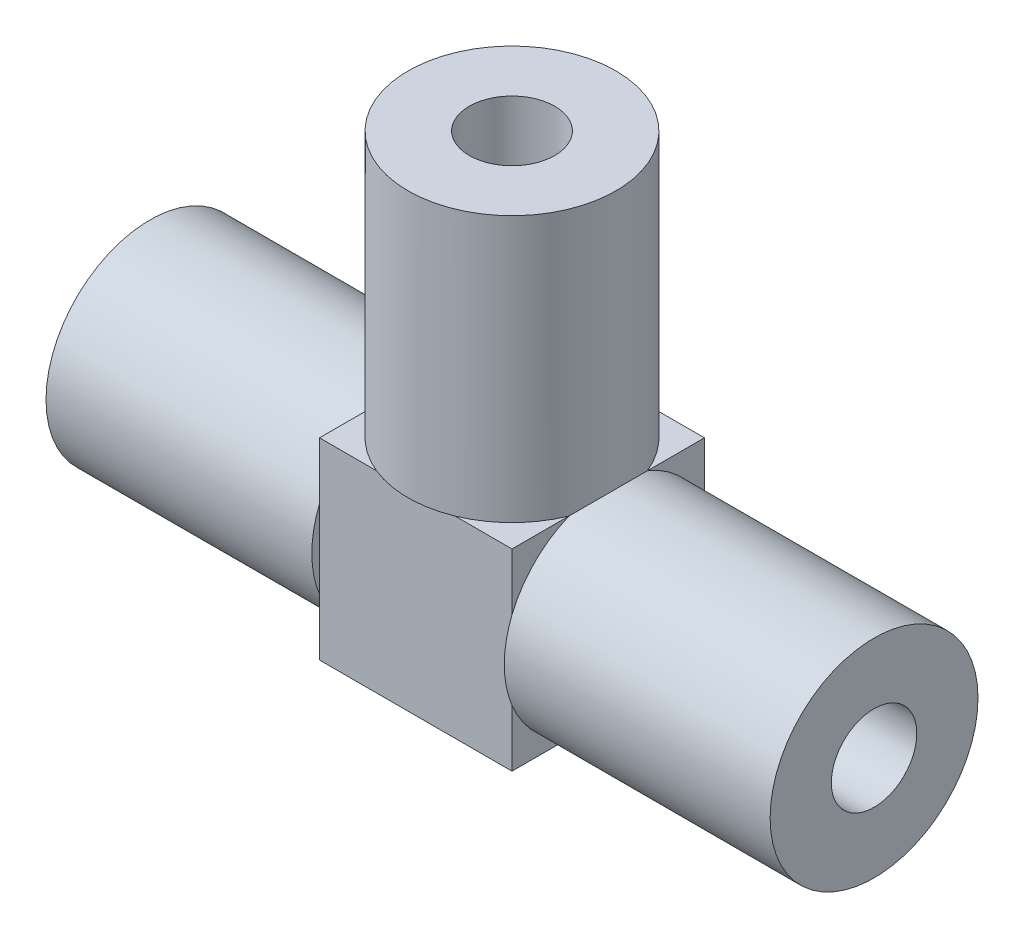
ISO-10303-21;
HEADER;
FILE_DESCRIPTION(('STEP AP214'),'2;1');
FILE_NAME('part.step','',(''),(''),'','','');
FILE_SCHEMA(('AUTOMOTIVE_DESIGN { 1 0 10303 214 1 1 1 1 }'));
ENDSEC;
DATA;
#1=APPLICATION_CONTEXT('core data for automotive mechanical design processes');
#2=APPLICATION_PROTOCOL_DEFINITION('international standard','automotive_design',2000,#1);
#3=PRODUCT_CONTEXT('',#1,'mechanical');
#4=PRODUCT('Part','Part','',(#3));
#5=PRODUCT_RELATED_PRODUCT_CATEGORY('part','',(#4));
#6=PRODUCT_DEFINITION_FORMATION('','',#4);
#7=PRODUCT_DEFINITION_CONTEXT('part definition',#1,'design');
#8=PRODUCT_DEFINITION('design','',#6,#7);
#9=PRODUCT_DEFINITION_SHAPE('','',#8);
#10=(LENGTH_UNIT() NAMED_UNIT(*) SI_UNIT(.MILLI.,.METRE.));
#11=(NAMED_UNIT(*) PLANE_ANGLE_UNIT() SI_UNIT($,.RADIAN.));
#12=(NAMED_UNIT(*) SI_UNIT($,.STERADIAN.) SOLID_ANGLE_UNIT());
#13=UNCERTAINTY_MEASURE_WITH_UNIT(LENGTH_MEASURE(1.E-05),#10,'distance_accuracy_value','');
#14=(GEOMETRIC_REPRESENTATION_CONTEXT(3) GLOBAL_UNCERTAINTY_ASSIGNED_CONTEXT((#13)) GLOBAL_UNIT_ASSIGNED_CONTEXT((#10,
#11,#12)) REPRESENTATION_CONTEXT('',''));
#15=CARTESIAN_POINT('',(0.,0.,0.));
#16=DIRECTION('',(0.,0.,1.));
#17=DIRECTION('',(1.,0.,0.));
#18=AXIS2_PLACEMENT_3D('',#15,#16,#17);
#19=CARTESIAN_POINT('',(-7.15,7.15,7.15));
#20=DIRECTION('',(1.,0.,0.));
#21=DIRECTION('',(0.,0.,-1.));
#22=AXIS2_PLACEMENT_3D('',#19,#20,#21);
#23=PLANE('',#22);
#24=CARTESIAN_POINT('',(-7.14999999999999,0.,0.));
#25=DIRECTION('',(-1.,0.,0.));
#26=DIRECTION('',(0.,0.,1.));
#27=AXIS2_PLACEMENT_3D('',#24,#25,#26);
#28=CIRCLE('',#27,7.722);
#29=CARTESIAN_POINT('',(-7.14999999999999,-2.91663916177508,-7.15));
#30=VERTEX_POINT('',#29);
#31=CARTESIAN_POINT('',(-7.14999999999999,-7.15,-2.91663916177508));
#32=VERTEX_POINT('',#31);
#33=EDGE_CURVE('E304',#30,#32,#28,.T.);
#34=ORIENTED_EDGE('',*,*,#33,.F.);
#35=DIRECTION('',(0.,-1.,0.));
#36=VECTOR('',#35,1.);
#37=CARTESIAN_POINT('',(-7.15,7.15,-7.15));
#38=LINE('',#37,#36);
#39=CARTESIAN_POINT('',(-7.15,-7.15,-7.15));
#40=VERTEX_POINT('',#39);
#41=EDGE_CURVE('E197',#30,#40,#38,.T.);
#42=ORIENTED_EDGE('',*,*,#41,.T.);
#43=DIRECTION('',(0.,0.,-1.));
#44=VECTOR('',#43,1.);
#45=CARTESIAN_POINT('',(-7.15,-7.15,7.15));
#46=LINE('',#45,#44);
#47=EDGE_CURVE('E217',#32,#40,#46,.T.);
#48=ORIENTED_EDGE('',*,*,#47,.F.);
#49=EDGE_LOOP('',(#34,#42,#48));
#50=FACE_BOUND('',#49,.T.);
#51=ADVANCED_FACE('F41',(#50),#23,.F.);
#52=CARTESIAN_POINT('',(-7.14999999999999,-7.15,2.91663916177508));
#53=VERTEX_POINT('',#52);
#54=CARTESIAN_POINT('',(-7.14999999999999,-2.91663916177508,7.15));
#55=VERTEX_POINT('',#54);
#56=EDGE_CURVE('E166',#53,#55,#28,.T.);
#57=ORIENTED_EDGE('',*,*,#56,.F.);
#58=CARTESIAN_POINT('',(-7.15,-7.15,7.15));
#59=VERTEX_POINT('',#58);
#60=EDGE_CURVE('E219',#59,#53,#46,.T.);
#61=ORIENTED_EDGE('',*,*,#60,.F.);
#62=DIRECTION('',(0.,-1.,0.));
#63=VECTOR('',#62,1.);
#64=CARTESIAN_POINT('',(-7.15,7.15,7.15));
#65=LINE('',#64,#63);
#66=EDGE_CURVE('E98',#55,#59,#65,.T.);
#67=ORIENTED_EDGE('',*,*,#66,.F.);
#68=EDGE_LOOP('',(#57,#61,#67));
#69=FACE_BOUND('',#68,.T.);
#70=ADVANCED_FACE('F303',(#69),#23,.F.);
#71=CARTESIAN_POINT('',(-7.14999999999999,2.91663916177508,7.15));
#72=VERTEX_POINT('',#71);
#73=CARTESIAN_POINT('',(-7.15,7.14999999999999,2.91663916177508));
#74=VERTEX_POINT('',#73);
#75=EDGE_CURVE('E164',#72,#74,#28,.T.);
#76=ORIENTED_EDGE('',*,*,#75,.F.);
#77=CARTESIAN_POINT('',(-7.15,7.15,7.15));
#78=VERTEX_POINT('',#77);
#79=EDGE_CURVE('E174',#78,#72,#65,.T.);
#80=ORIENTED_EDGE('',*,*,#79,.F.);
#81=DIRECTION('',(0.,0.,-1.));
#82=VECTOR('',#81,1.);
#83=CARTESIAN_POINT('',(-7.15,7.15,7.15));
#84=LINE('',#83,#82);
#85=EDGE_CURVE('E176',#78,#74,#84,.T.);
#86=ORIENTED_EDGE('',*,*,#85,.T.);
#87=EDGE_LOOP('',(#76,#80,#86));
#88=FACE_BOUND('',#87,.T.);
#89=ADVANCED_FACE('F172',(#88),#23,.F.);
#90=CARTESIAN_POINT('',(0.,-500.,0.));
#91=DIRECTION('',(0.,-1.,0.));
#92=DIRECTION('',(0.,0.,-1.));
#93=AXIS2_PLACEMENT_3D('',#90,#91,#92);
#94=CYLINDRICAL_SURFACE('',#93,7.722);
#95=CARTESIAN_POINT('',(0.,26.9,0.));
#96=DIRECTION('',(0.,-1.,0.));
#97=DIRECTION('',(0.,0.,-1.));
#98=AXIS2_PLACEMENT_3D('',#95,#96,#97);
#99=CIRCLE('',#98,7.722);
#100=CARTESIAN_POINT('',(0.,26.9,-7.722));
#101=VERTEX_POINT('',#100);
#102=EDGE_CURVE('E229',#101,#101,#99,.T.);
#103=ORIENTED_EDGE('',*,*,#102,.T.);
#104=EDGE_LOOP('',(#103));
#105=FACE_BOUND('',#104,.T.);
#106=CARTESIAN_POINT('',(0.,7.14999999999999,0.));
#107=DIRECTION('',(0.,-1.,0.));
#108=DIRECTION('',(0.,0.,-1.));
#109=AXIS2_PLACEMENT_3D('',#106,#107,#108);
#110=CIRCLE('',#109,7.722);
#111=CARTESIAN_POINT('',(-7.14999999999999,7.14999999999999,-2.9166391617751));
#112=VERTEX_POINT('',#111);
#113=CARTESIAN_POINT('',(-2.91663916177508,7.14999999999999,-7.15));
#114=VERTEX_POINT('',#113);
#115=EDGE_CURVE('E407',#112,#114,#110,.T.);
#116=ORIENTED_EDGE('',*,*,#115,.F.);
#117=CARTESIAN_POINT('',(0.,0.,0.));
#118=DIRECTION('',(-0.707106781186547,-0.707106781186547,0.));
#119=DIRECTION('',(0.707106781186547,-0.707106781186547,0.));
#120=AXIS2_PLACEMENT_3D('',#117,#118,#119);
#121=ELLIPSE('',#120,10.920557128645,7.722);
#122=EDGE_CURVE('E11',#112,#74,#121,.F.);
#123=ORIENTED_EDGE('',*,*,#122,.T.);
#124=CARTESIAN_POINT('',(-2.91663916177508,7.14999999999999,7.15));
#125=VERTEX_POINT('',#124);
#126=EDGE_CURVE('E406',#125,#74,#110,.T.);
#127=ORIENTED_EDGE('',*,*,#126,.F.);
#128=CARTESIAN_POINT('',(2.91663916177508,7.14999999999999,7.15));
#129=VERTEX_POINT('',#128);
#130=EDGE_CURVE('E403',#129,#125,#110,.T.);
#131=ORIENTED_EDGE('',*,*,#130,.F.);
#132=CARTESIAN_POINT('',(7.14999999999999,7.15,2.91663916177508));
#133=VERTEX_POINT('',#132);
#134=EDGE_CURVE('E255',#133,#129,#110,.T.);
#135=ORIENTED_EDGE('',*,*,#134,.F.);
#136=CARTESIAN_POINT('',(0.,0.,0.));
#137=DIRECTION('',(-0.707106781186547,0.707106781186547,0.));
#138=DIRECTION('',(-0.707106781186547,-0.707106781186547,0.));
#139=AXIS2_PLACEMENT_3D('',#136,#137,#138);
#140=ELLIPSE('',#139,10.920557128645,7.722);
#141=CARTESIAN_POINT('',(7.14999999999999,7.14999999999999,-2.9166391617751));
#142=VERTEX_POINT('',#141);
#143=EDGE_CURVE('E49',#142,#133,#140,.F.);
#144=ORIENTED_EDGE('',*,*,#143,.F.);
#145=CARTESIAN_POINT('',(2.91663916177508,7.14999999999999,-7.15));
#146=VERTEX_POINT('',#145);
#147=EDGE_CURVE('E247',#146,#142,#110,.T.);
#148=ORIENTED_EDGE('',*,*,#147,.F.);
#149=EDGE_CURVE('E250',#114,#146,#110,.T.);
#150=ORIENTED_EDGE('',*,*,#149,.F.);
#151=EDGE_LOOP('',(#116,#123,#127,#131,#135,#144,#148,#150));
#152=FACE_BOUND('',#151,.T.);
#153=ADVANCED_FACE('F352',(#105,#152),#94,.T.);
#154=CARTESIAN_POINT('',(7.15,7.15,7.15));
#155=DIRECTION('',(0.,-1.,0.));
#156=DIRECTION('',(0.,0.,-1.));
#157=AXIS2_PLACEMENT_3D('',#154,#155,#156);
#158=PLANE('',#157);
#159=DIRECTION('',(-1.,0.,0.));
#160=VECTOR('',#159,1.);
#161=CARTESIAN_POINT('',(7.15,7.15,-7.15));
#162=LINE('',#161,#160);
#163=CARTESIAN_POINT('',(7.15,7.15,-7.15));
#164=VERTEX_POINT('',#163);
#165=EDGE_CURVE('E182',#164,#146,#162,.T.);
#166=ORIENTED_EDGE('',*,*,#165,.T.);
#167=ORIENTED_EDGE('',*,*,#147,.T.);
#168=DIRECTION('',(0.,0.,-1.));
#169=VECTOR('',#168,1.);
#170=CARTESIAN_POINT('',(7.15,7.15,7.15));
#171=LINE('',#170,#169);
#172=EDGE_CURVE('E208',#142,#164,#171,.T.);
#173=ORIENTED_EDGE('',*,*,#172,.T.);
#174=EDGE_LOOP('',(#166,#167,#173));
#175=FACE_BOUND('',#174,.T.);
#176=ADVANCED_FACE('F353',(#175),#158,.F.);
#177=CARTESIAN_POINT('',(7.15,7.15,7.15));
#178=VERTEX_POINT('',#177);
#179=EDGE_CURVE('E214',#178,#133,#171,.T.);
#180=ORIENTED_EDGE('',*,*,#179,.T.);
#181=ORIENTED_EDGE('',*,*,#134,.T.);
#182=DIRECTION('',(-1.,0.,0.));
#183=VECTOR('',#182,1.);
#184=CARTESIAN_POINT('',(7.15,7.15,7.15));
#185=LINE('',#184,#183);
#186=EDGE_CURVE('E191',#178,#129,#185,.T.);
#187=ORIENTED_EDGE('',*,*,#186,.F.);
#188=EDGE_LOOP('',(#180,#181,#187));
#189=FACE_BOUND('',#188,.T.);
#190=ADVANCED_FACE('F363',(#189),#158,.F.);
#191=EDGE_CURVE('E66',#125,#78,#185,.T.);
#192=ORIENTED_EDGE('',*,*,#191,.F.);
#193=ORIENTED_EDGE('',*,*,#126,.T.);
#194=ORIENTED_EDGE('',*,*,#85,.F.);
#195=EDGE_LOOP('',(#192,#193,#194));
#196=FACE_BOUND('',#195,.T.);
#197=ADVANCED_FACE('F388',(#196),#158,.F.);
#198=CARTESIAN_POINT('',(7.15,-7.15,7.15));
#199=DIRECTION('',(-1.,0.,0.));
#200=DIRECTION('',(0.,0.,1.));
#201=AXIS2_PLACEMENT_3D('',#198,#199,#200);
#202=PLANE('',#201);
#203=DIRECTION('',(0.,1.,0.));
#204=VECTOR('',#203,1.);
#205=CARTESIAN_POINT('',(7.15,-7.15,7.15));
#206=LINE('',#205,#204);
#207=CARTESIAN_POINT('',(7.14999999999999,2.91663916177508,7.15));
#208=VERTEX_POINT('',#207);
#209=EDGE_CURVE('E181',#208,#178,#206,.T.);
#210=ORIENTED_EDGE('',*,*,#209,.F.);
#211=CARTESIAN_POINT('',(7.14999999999999,0.,0.));
#212=DIRECTION('',(-1.,0.,0.));
#213=DIRECTION('',(0.,0.,1.));
#214=AXIS2_PLACEMENT_3D('',#211,#212,#213);
#215=CIRCLE('',#214,7.722);
#216=EDGE_CURVE('E259',#208,#133,#215,.T.);
#217=ORIENTED_EDGE('',*,*,#216,.T.);
#218=ORIENTED_EDGE('',*,*,#179,.F.);
#219=EDGE_LOOP('',(#210,#217,#218));
#220=FACE_BOUND('',#219,.T.);
#221=ADVANCED_FACE('F391',(#220),#202,.F.);
#222=ORIENTED_EDGE('',*,*,#172,.F.);
#223=CARTESIAN_POINT('',(7.14999999999999,2.91663916177508,-7.15));
#224=VERTEX_POINT('',#223);
#225=EDGE_CURVE('E228',#142,#224,#215,.T.);
#226=ORIENTED_EDGE('',*,*,#225,.T.);
#227=DIRECTION('',(0.,1.,0.));
#228=VECTOR('',#227,1.);
#229=CARTESIAN_POINT('',(7.15,-7.15,-7.15));
#230=LINE('',#229,#228);
#231=EDGE_CURVE('E202',#224,#164,#230,.T.);
#232=ORIENTED_EDGE('',*,*,#231,.T.);
#233=EDGE_LOOP('',(#222,#226,#232));
#234=FACE_BOUND('',#233,.T.);
#235=ADVANCED_FACE('F280',(#234),#202,.F.);
#236=CARTESIAN_POINT('',(7.15,-7.15,-7.15));
#237=VERTEX_POINT('',#236);
#238=CARTESIAN_POINT('',(7.14999999999999,-2.91663916177508,-7.15));
#239=VERTEX_POINT('',#238);
#240=EDGE_CURVE('E204',#237,#239,#230,.T.);
#241=ORIENTED_EDGE('',*,*,#240,.T.);
#242=CARTESIAN_POINT('',(7.14999999999999,-7.15,-2.91663916177508));
#243=VERTEX_POINT('',#242);
#244=EDGE_CURVE('E267',#239,#243,#215,.T.);
#245=ORIENTED_EDGE('',*,*,#244,.T.);
#246=DIRECTION('',(0.,0.,-1.));
#247=VECTOR('',#246,1.);
#248=CARTESIAN_POINT('',(7.15,-7.15,7.15));
#249=LINE('',#248,#247);
#250=EDGE_CURVE('E213',#243,#237,#249,.T.);
#251=ORIENTED_EDGE('',*,*,#250,.T.);
#252=EDGE_LOOP('',(#241,#245,#251));
#253=FACE_BOUND('',#252,.T.);
#254=ADVANCED_FACE('F345',(#253),#202,.F.);
#255=CARTESIAN_POINT('',(-7.14999999999999,2.91663916177508,-7.15));
#256=VERTEX_POINT('',#255);
#257=EDGE_CURVE('E180',#112,#256,#28,.T.);
#258=ORIENTED_EDGE('',*,*,#257,.F.);
#259=CARTESIAN_POINT('',(-7.15,7.15,-7.15));
#260=VERTEX_POINT('',#259);
#261=EDGE_CURVE('E88',#112,#260,#84,.T.);
#262=ORIENTED_EDGE('',*,*,#261,.T.);
#263=EDGE_CURVE('E192',#260,#256,#38,.T.);
#264=ORIENTED_EDGE('',*,*,#263,.T.);
#265=EDGE_LOOP('',(#258,#262,#264));
#266=FACE_BOUND('',#265,.T.);
#267=ADVANCED_FACE('F43',(#266),#23,.F.);
#268=CARTESIAN_POINT('',(-7.15,-7.15,7.15));
#269=DIRECTION('',(0.,1.,0.));
#270=DIRECTION('',(0.,0.,1.));
#271=AXIS2_PLACEMENT_3D('',#268,#269,#270);
#272=PLANE('',#271);
#273=DIRECTION('',(1.,0.,0.));
#274=VECTOR('',#273,1.);
#275=CARTESIAN_POINT('',(-7.15,-7.15,-7.15));
#276=LINE('',#275,#274);
#277=EDGE_CURVE('E200',#40,#237,#276,.T.);
#278=ORIENTED_EDGE('',*,*,#277,.T.);
#279=ORIENTED_EDGE('',*,*,#250,.F.);
#280=CARTESIAN_POINT('',(7.14999999999999,-7.15,2.91663916177508));
#281=VERTEX_POINT('',#280);
#282=EDGE_CURVE('E218',#281,#243,#249,.T.);
#283=ORIENTED_EDGE('',*,*,#282,.F.);
#284=CARTESIAN_POINT('',(7.15,-7.15,7.15));
#285=VERTEX_POINT('',#284);
#286=EDGE_CURVE('E212',#285,#281,#249,.T.);
#287=ORIENTED_EDGE('',*,*,#286,.F.);
#288=DIRECTION('',(1.,0.,0.));
#289=VECTOR('',#288,1.);
#290=CARTESIAN_POINT('',(-7.15,-7.15,7.15));
#291=LINE('',#290,#289);
#292=EDGE_CURVE('E177',#59,#285,#291,.T.);
#293=ORIENTED_EDGE('',*,*,#292,.F.);
#294=ORIENTED_EDGE('',*,*,#60,.T.);
#295=DIRECTION('',(0.,0.,1.));
#296=VECTOR('',#295,1.);
#297=CARTESIAN_POINT('',(-7.15,-7.15,7.15));
#298=LINE('',#297,#296);
#299=EDGE_CURVE('E160',#32,#53,#298,.T.);
#300=ORIENTED_EDGE('',*,*,#299,.F.);
#301=ORIENTED_EDGE('',*,*,#47,.T.);
#302=EDGE_LOOP('',(#278,#279,#283,#287,#293,#294,#300,#301));
#303=FACE_BOUND('',#302,.T.);
#304=ADVANCED_FACE('F300',(#303),#272,.F.);
#305=ORIENTED_EDGE('',*,*,#286,.T.);
#306=CARTESIAN_POINT('',(7.14999999999999,-2.91663916177508,7.15));
#307=VERTEX_POINT('',#306);
#308=EDGE_CURVE('E225',#281,#307,#215,.T.);
#309=ORIENTED_EDGE('',*,*,#308,.T.);
#310=EDGE_CURVE('E189',#285,#307,#206,.T.);
#311=ORIENTED_EDGE('',*,*,#310,.F.);
#312=EDGE_LOOP('',(#305,#309,#311));
#313=FACE_BOUND('',#312,.T.);
#314=ADVANCED_FACE('F296',(#313),#202,.F.);
#315=ORIENTED_EDGE('',*,*,#261,.F.);
#316=ORIENTED_EDGE('',*,*,#115,.T.);
#317=EDGE_CURVE('E203',#114,#260,#162,.T.);
#318=ORIENTED_EDGE('',*,*,#317,.T.);
#319=EDGE_LOOP('',(#315,#316,#318));
#320=FACE_BOUND('',#319,.T.);
#321=ADVANCED_FACE('F364',(#320),#158,.F.);
#322=CARTESIAN_POINT('',(0.,0.,7.15));
#323=DIRECTION('',(0.,0.,1.));
#324=DIRECTION('',(1.,0.,0.));
#325=AXIS2_PLACEMENT_3D('',#322,#323,#324);
#326=PLANE('',#325);
#327=ORIENTED_EDGE('',*,*,#79,.T.);
#328=DIRECTION('',(0.,-1.,0.));
#329=VECTOR('',#328,1.);
#330=CARTESIAN_POINT('',(-7.15,0.,7.15));
#331=LINE('',#330,#329);
#332=EDGE_CURVE('E152',#72,#55,#331,.T.);
#333=ORIENTED_EDGE('',*,*,#332,.T.);
#334=ORIENTED_EDGE('',*,*,#66,.T.);
#335=ORIENTED_EDGE('',*,*,#292,.T.);
#336=ORIENTED_EDGE('',*,*,#310,.T.);
#337=EDGE_CURVE('E194',#307,#208,#206,.T.);
#338=ORIENTED_EDGE('',*,*,#337,.T.);
#339=ORIENTED_EDGE('',*,*,#209,.T.);
#340=ORIENTED_EDGE('',*,*,#186,.T.);
#341=DIRECTION('',(1.,0.,0.));
#342=VECTOR('',#341,1.);
#343=CARTESIAN_POINT('',(0.,7.15,7.15));
#344=LINE('',#343,#342);
#345=EDGE_CURVE('E253',#125,#129,#344,.T.);
#346=ORIENTED_EDGE('',*,*,#345,.F.);
#347=ORIENTED_EDGE('',*,*,#191,.T.);
#348=EDGE_LOOP('',(#327,#333,#334,#335,#336,#338,#339,#340,#346,#347));
#349=FACE_BOUND('',#348,.T.);
#350=ADVANCED_FACE('F178',(#349),#326,.T.);
#351=CARTESIAN_POINT('',(0.,0.,-7.15));
#352=DIRECTION('',(0.,0.,1.));
#353=DIRECTION('',(1.,0.,0.));
#354=AXIS2_PLACEMENT_3D('',#351,#352,#353);
#355=PLANE('',#354);
#356=ORIENTED_EDGE('',*,*,#263,.F.);
#357=ORIENTED_EDGE('',*,*,#317,.F.);
#358=DIRECTION('',(1.,0.,0.));
#359=VECTOR('',#358,1.);
#360=CARTESIAN_POINT('',(0.,7.15,-7.15));
#361=LINE('',#360,#359);
#362=EDGE_CURVE('E252',#114,#146,#361,.T.);
#363=ORIENTED_EDGE('',*,*,#362,.T.);
#364=ORIENTED_EDGE('',*,*,#165,.F.);
#365=ORIENTED_EDGE('',*,*,#231,.F.);
#366=EDGE_CURVE('E207',#239,#224,#230,.T.);
#367=ORIENTED_EDGE('',*,*,#366,.F.);
#368=ORIENTED_EDGE('',*,*,#240,.F.);
#369=ORIENTED_EDGE('',*,*,#277,.F.);
#370=ORIENTED_EDGE('',*,*,#41,.F.);
#371=DIRECTION('',(0.,-1.,0.));
#372=VECTOR('',#371,1.);
#373=CARTESIAN_POINT('',(-7.15,0.,-7.15));
#374=LINE('',#373,#372);
#375=EDGE_CURVE('E156',#256,#30,#374,.T.);
#376=ORIENTED_EDGE('',*,*,#375,.F.);
#377=EDGE_LOOP('',(#356,#357,#363,#364,#365,#367,#368,#369,#370,#376));
#378=FACE_BOUND('',#377,.T.);
#379=ADVANCED_FACE('F283',(#378),#355,.F.);
#380=CARTESIAN_POINT('',(7.15,7.722,0.));
#381=DIRECTION('',(1.,0.,0.));
#382=DIRECTION('',(0.,0.,-1.));
#383=AXIS2_PLACEMENT_3D('',#380,#381,#382);
#384=PLANE('',#383);
#385=EDGE_CURVE('E260',#224,#239,#215,.T.);
#386=ORIENTED_EDGE('',*,*,#385,.T.);
#387=ORIENTED_EDGE('',*,*,#366,.T.);
#388=EDGE_LOOP('',(#386,#387));
#389=FACE_BOUND('',#388,.T.);
#390=ADVANCED_FACE('F289',(#389),#384,.F.);
#391=EDGE_CURVE('E263',#243,#281,#215,.T.);
#392=ORIENTED_EDGE('',*,*,#391,.T.);
#393=ORIENTED_EDGE('',*,*,#282,.T.);
#394=EDGE_LOOP('',(#392,#393));
#395=FACE_BOUND('',#394,.T.);
#396=ADVANCED_FACE('F295',(#395),#384,.F.);
#397=ORIENTED_EDGE('',*,*,#337,.F.);
#398=EDGE_CURVE('E60',#307,#208,#215,.T.);
#399=ORIENTED_EDGE('',*,*,#398,.T.);
#400=EDGE_LOOP('',(#397,#399));
#401=FACE_BOUND('',#400,.T.);
#402=ADVANCED_FACE('F379',(#401),#384,.F.);
#403=CARTESIAN_POINT('',(26.9,0.,0.));
#404=DIRECTION('',(-1.,0.,0.));
#405=DIRECTION('',(0.,0.,1.));
#406=AXIS2_PLACEMENT_3D('',#403,#404,#405);
#407=PLANE('',#406);
#408=CARTESIAN_POINT('',(26.8999999999999,0.,0.));
#409=DIRECTION('',(-1.,0.,0.));
#410=DIRECTION('',(0.,0.,1.));
#411=AXIS2_PLACEMENT_3D('',#408,#409,#410);
#412=CIRCLE('',#411,3.175);
#413=CARTESIAN_POINT('',(26.8999999999999,0.,3.175));
#414=VERTEX_POINT('',#413);
#415=EDGE_CURVE('E227',#414,#414,#412,.F.);
#416=ORIENTED_EDGE('',*,*,#415,.F.);
#417=EDGE_LOOP('',(#416));
#418=FACE_BOUND('',#417,.T.);
#419=CARTESIAN_POINT('',(26.8999999999999,0.,0.));
#420=DIRECTION('',(-1.,0.,0.));
#421=DIRECTION('',(0.,0.,1.));
#422=AXIS2_PLACEMENT_3D('',#419,#420,#421);
#423=CIRCLE('',#422,7.722);
#424=CARTESIAN_POINT('',(26.8999999999999,0.,7.722));
#425=VERTEX_POINT('',#424);
#426=EDGE_CURVE('E184',#425,#425,#423,.T.);
#427=ORIENTED_EDGE('',*,*,#426,.F.);
#428=EDGE_LOOP('',(#427));
#429=FACE_BOUND('',#428,.T.);
#430=ADVANCED_FACE('F380',(#418,#429),#407,.F.);
#431=CARTESIAN_POINT('',(-1000.,0.,0.));
#432=DIRECTION('',(-1.,0.,0.));
#433=DIRECTION('',(0.,0.,1.));
#434=AXIS2_PLACEMENT_3D('',#431,#432,#433);
#435=CYLINDRICAL_SURFACE('',#434,7.722);
#436=ORIENTED_EDGE('',*,*,#225,.F.);
#437=ORIENTED_EDGE('',*,*,#143,.T.);
#438=ORIENTED_EDGE('',*,*,#216,.F.);
#439=ORIENTED_EDGE('',*,*,#398,.F.);
#440=ORIENTED_EDGE('',*,*,#308,.F.);
#441=ORIENTED_EDGE('',*,*,#391,.F.);
#442=ORIENTED_EDGE('',*,*,#244,.F.);
#443=ORIENTED_EDGE('',*,*,#385,.F.);
#444=EDGE_LOOP('',(#436,#437,#438,#439,#440,#441,#442,#443));
#445=FACE_BOUND('',#444,.T.);
#446=ORIENTED_EDGE('',*,*,#426,.T.);
#447=EDGE_LOOP('',(#446));
#448=FACE_BOUND('',#447,.T.);
#449=ADVANCED_FACE('F290',(#445,#448),#435,.T.);
#450=CARTESIAN_POINT('',(0.,7.15,0.));
#451=DIRECTION('',(0.,-1.,0.));
#452=DIRECTION('',(0.,0.,-1.));
#453=AXIS2_PLACEMENT_3D('',#450,#451,#452);
#454=PLANE('',#453);
#455=ORIENTED_EDGE('',*,*,#362,.F.);
#456=ORIENTED_EDGE('',*,*,#149,.T.);
#457=EDGE_LOOP('',(#455,#456));
#458=FACE_BOUND('',#457,.T.);
#459=ADVANCED_FACE('F369',(#458),#454,.T.);
#460=ORIENTED_EDGE('',*,*,#130,.T.);
#461=ORIENTED_EDGE('',*,*,#345,.T.);
#462=EDGE_LOOP('',(#460,#461));
#463=FACE_BOUND('',#462,.T.);
#464=ADVANCED_FACE('F373',(#463),#454,.T.);
#465=CARTESIAN_POINT('',(7.722,26.9,0.));
#466=DIRECTION('',(0.,1.,0.));
#467=DIRECTION('',(0.,0.,1.));
#468=AXIS2_PLACEMENT_3D('',#465,#466,#467);
#469=PLANE('',#468);
#470=CARTESIAN_POINT('',(0.,26.9,0.));
#471=DIRECTION('',(0.,1.,0.));
#472=DIRECTION('',(0.,0.,1.));
#473=AXIS2_PLACEMENT_3D('',#470,#471,#472);
#474=CIRCLE('',#473,3.175);
#475=CARTESIAN_POINT('',(0.,26.9,3.175));
#476=VERTEX_POINT('',#475);
#477=EDGE_CURVE('E235',#476,#476,#474,.T.);
#478=ORIENTED_EDGE('',*,*,#477,.F.);
#479=EDGE_LOOP('',(#478));
#480=FACE_BOUND('',#479,.T.);
#481=ORIENTED_EDGE('',*,*,#102,.F.);
#482=EDGE_LOOP('',(#481));
#483=FACE_BOUND('',#482,.T.);
#484=ADVANCED_FACE('F368',(#480,#483),#469,.T.);
#485=CARTESIAN_POINT('',(-1000.,0.,0.));
#486=DIRECTION('',(-1.,0.,0.));
#487=DIRECTION('',(0.,0.,1.));
#488=AXIS2_PLACEMENT_3D('',#485,#486,#487);
#489=CYLINDRICAL_SURFACE('',#488,3.175);
#490=CARTESIAN_POINT('',(11.7,0.,0.));
#491=DIRECTION('',(-1.,0.,0.));
#492=DIRECTION('',(0.,0.,1.));
#493=AXIS2_PLACEMENT_3D('',#490,#491,#492);
#494=CIRCLE('',#493,3.175);
#495=CARTESIAN_POINT('',(11.7,0.,3.175));
#496=VERTEX_POINT('',#495);
#497=EDGE_CURVE('E233',#496,#496,#494,.T.);
#498=ORIENTED_EDGE('',*,*,#497,.T.);
#499=EDGE_LOOP('',(#498));
#500=FACE_BOUND('',#499,.T.);
#501=ORIENTED_EDGE('',*,*,#415,.T.);
#502=EDGE_LOOP('',(#501));
#503=FACE_BOUND('',#502,.T.);
#504=ADVANCED_FACE('F418',(#500,#503),#489,.F.);
#505=CARTESIAN_POINT('',(11.7,3.175,0.));
#506=DIRECTION('',(1.,0.,0.));
#507=DIRECTION('',(0.,0.,-1.));
#508=AXIS2_PLACEMENT_3D('',#505,#506,#507);
#509=PLANE('',#508);
#510=ORIENTED_EDGE('',*,*,#497,.F.);
#511=EDGE_LOOP('',(#510));
#512=FACE_BOUND('',#511,.T.);
#513=ADVANCED_FACE('F430',(#512),#509,.T.);
#514=CARTESIAN_POINT('',(0.,11.7,0.));
#515=DIRECTION('',(0.,-1.,0.));
#516=DIRECTION('',(0.,0.,-1.));
#517=AXIS2_PLACEMENT_3D('',#514,#515,#516);
#518=PLANE('',#517);
#519=CARTESIAN_POINT('',(0.,11.7,0.));
#520=DIRECTION('',(0.,-1.,0.));
#521=DIRECTION('',(0.,0.,-1.));
#522=AXIS2_PLACEMENT_3D('',#519,#520,#521);
#523=CIRCLE('',#522,3.175);
#524=CARTESIAN_POINT('',(0.,11.7,-3.175));
#525=VERTEX_POINT('',#524);
#526=EDGE_CURVE('E234',#525,#525,#523,.T.);
#527=ORIENTED_EDGE('',*,*,#526,.F.);
#528=EDGE_LOOP('',(#527));
#529=FACE_BOUND('',#528,.T.);
#530=ADVANCED_FACE('F335',(#529),#518,.F.);
#531=CARTESIAN_POINT('',(0.,-500.,0.));
#532=DIRECTION('',(0.,-1.,0.));
#533=DIRECTION('',(0.,0.,-1.));
#534=AXIS2_PLACEMENT_3D('',#531,#532,#533);
#535=CYLINDRICAL_SURFACE('',#534,3.175);
#536=ORIENTED_EDGE('',*,*,#477,.T.);
#537=EDGE_LOOP('',(#536));
#538=FACE_BOUND('',#537,.T.);
#539=ORIENTED_EDGE('',*,*,#526,.T.);
#540=EDGE_LOOP('',(#539));
#541=FACE_BOUND('',#540,.T.);
#542=ADVANCED_FACE('F322',(#538,#541),#535,.F.);
#543=CARTESIAN_POINT('',(-7.15,0.,0.));
#544=DIRECTION('',(-1.,0.,0.));
#545=DIRECTION('',(0.,0.,1.));
#546=AXIS2_PLACEMENT_3D('',#543,#544,#545);
#547=PLANE('',#546);
#548=EDGE_CURVE('E302',#32,#53,#28,.T.);
#549=ORIENTED_EDGE('',*,*,#548,.F.);
#550=ORIENTED_EDGE('',*,*,#299,.T.);
#551=EDGE_LOOP('',(#549,#550));
#552=FACE_BOUND('',#551,.T.);
#553=ADVANCED_FACE('F325',(#552),#547,.F.);
#554=EDGE_CURVE('E312',#256,#30,#28,.T.);
#555=ORIENTED_EDGE('',*,*,#554,.F.);
#556=ORIENTED_EDGE('',*,*,#375,.T.);
#557=EDGE_LOOP('',(#555,#556));
#558=FACE_BOUND('',#557,.T.);
#559=ADVANCED_FACE('F315',(#558),#547,.F.);
#560=CARTESIAN_POINT('',(-26.9,7.722,0.));
#561=DIRECTION('',(1.,0.,0.));
#562=DIRECTION('',(0.,0.,-1.));
#563=AXIS2_PLACEMENT_3D('',#560,#561,#562);
#564=PLANE('',#563);
#565=CARTESIAN_POINT('',(-26.9,0.,0.));
#566=DIRECTION('',(1.,0.,0.));
#567=DIRECTION('',(0.,0.,-1.));
#568=AXIS2_PLACEMENT_3D('',#565,#566,#567);
#569=CIRCLE('',#568,3.175);
#570=CARTESIAN_POINT('',(-26.9,0.,-3.175));
#571=VERTEX_POINT('',#570);
#572=EDGE_CURVE('E44',#571,#571,#569,.F.);
#573=ORIENTED_EDGE('',*,*,#572,.F.);
#574=EDGE_LOOP('',(#573));
#575=FACE_BOUND('',#574,.T.);
#576=CARTESIAN_POINT('',(-26.9,0.,0.));
#577=DIRECTION('',(-1.,0.,0.));
#578=DIRECTION('',(0.,0.,1.));
#579=AXIS2_PLACEMENT_3D('',#576,#577,#578);
#580=CIRCLE('',#579,7.722);
#581=CARTESIAN_POINT('',(-26.9,0.,7.722));
#582=VERTEX_POINT('',#581);
#583=EDGE_CURVE('E169',#582,#582,#580,.T.);
#584=ORIENTED_EDGE('',*,*,#583,.T.);
#585=EDGE_LOOP('',(#584));
#586=FACE_BOUND('',#585,.T.);
#587=ADVANCED_FACE('F332',(#575,#586),#564,.F.);
#588=ORIENTED_EDGE('',*,*,#332,.F.);
#589=EDGE_CURVE('E157',#55,#72,#28,.T.);
#590=ORIENTED_EDGE('',*,*,#589,.F.);
#591=EDGE_LOOP('',(#588,#590));
#592=FACE_BOUND('',#591,.T.);
#593=ADVANCED_FACE('F154',(#592),#547,.F.);
#594=CARTESIAN_POINT('',(-1000.,0.,0.));
#595=DIRECTION('',(-1.,0.,0.));
#596=DIRECTION('',(0.,0.,1.));
#597=AXIS2_PLACEMENT_3D('',#594,#595,#596);
#598=CYLINDRICAL_SURFACE('',#597,7.722);
#599=ORIENTED_EDGE('',*,*,#122,.F.);
#600=ORIENTED_EDGE('',*,*,#257,.T.);
#601=ORIENTED_EDGE('',*,*,#554,.T.);
#602=ORIENTED_EDGE('',*,*,#33,.T.);
#603=ORIENTED_EDGE('',*,*,#548,.T.);
#604=ORIENTED_EDGE('',*,*,#56,.T.);
#605=ORIENTED_EDGE('',*,*,#589,.T.);
#606=ORIENTED_EDGE('',*,*,#75,.T.);
#607=EDGE_LOOP('',(#599,#600,#601,#602,#603,#604,#605,#606));
#608=FACE_BOUND('',#607,.T.);
#609=ORIENTED_EDGE('',*,*,#583,.F.);
#610=EDGE_LOOP('',(#609));
#611=FACE_BOUND('',#610,.T.);
#612=ADVANCED_FACE('F161',(#608,#611),#598,.T.);
#613=CARTESIAN_POINT('',(-1000.,0.,0.));
#614=DIRECTION('',(-1.,0.,0.));
#615=DIRECTION('',(0.,0.,1.));
#616=AXIS2_PLACEMENT_3D('',#613,#614,#615);
#617=CYLINDRICAL_SURFACE('',#616,3.175);
#618=CARTESIAN_POINT('',(-11.7,0.,0.));
#619=DIRECTION('',(-1.,0.,0.));
#620=DIRECTION('',(0.,0.,1.));
#621=AXIS2_PLACEMENT_3D('',#618,#619,#620);
#622=CIRCLE('',#621,3.175);
#623=CARTESIAN_POINT('',(-11.7,0.,3.175));
#624=VERTEX_POINT('',#623);
#625=EDGE_CURVE('E446',#624,#624,#622,.T.);
#626=ORIENTED_EDGE('',*,*,#625,.F.);
#627=EDGE_LOOP('',(#626));
#628=FACE_BOUND('',#627,.T.);
#629=ORIENTED_EDGE('',*,*,#572,.T.);
#630=EDGE_LOOP('',(#629));
#631=FACE_BOUND('',#630,.T.);
#632=ADVANCED_FACE('F456',(#628,#631),#617,.F.);
#633=CARTESIAN_POINT('',(-11.7,0.,0.));
#634=DIRECTION('',(-1.,0.,0.));
#635=DIRECTION('',(0.,0.,1.));
#636=AXIS2_PLACEMENT_3D('',#633,#634,#635);
#637=PLANE('',#636);
#638=ORIENTED_EDGE('',*,*,#625,.T.);
#639=EDGE_LOOP('',(#638));
#640=FACE_BOUND('',#639,.T.);
#641=ADVANCED_FACE('F453',(#640),#637,.T.);
#642=CLOSED_SHELL('',(#51,#70,#89,#153,#176,#190,#197,#221,#235,#254,#267,#304,#314,#321,#350,
#379,#390,#396,#402,#430,#449,#459,#464,#484,#504,#513,#530,#542,#553,#559,#587,#593,#612,#632,#641));
#643=MANIFOLD_SOLID_BREP('B2',#642);
#644=ADVANCED_BREP_SHAPE_REPRESENTATION('',(#18,#643),#14);
#645=SHAPE_DEFINITION_REPRESENTATION(#9,#644);
ENDSEC;
END-ISO-10303-21;
